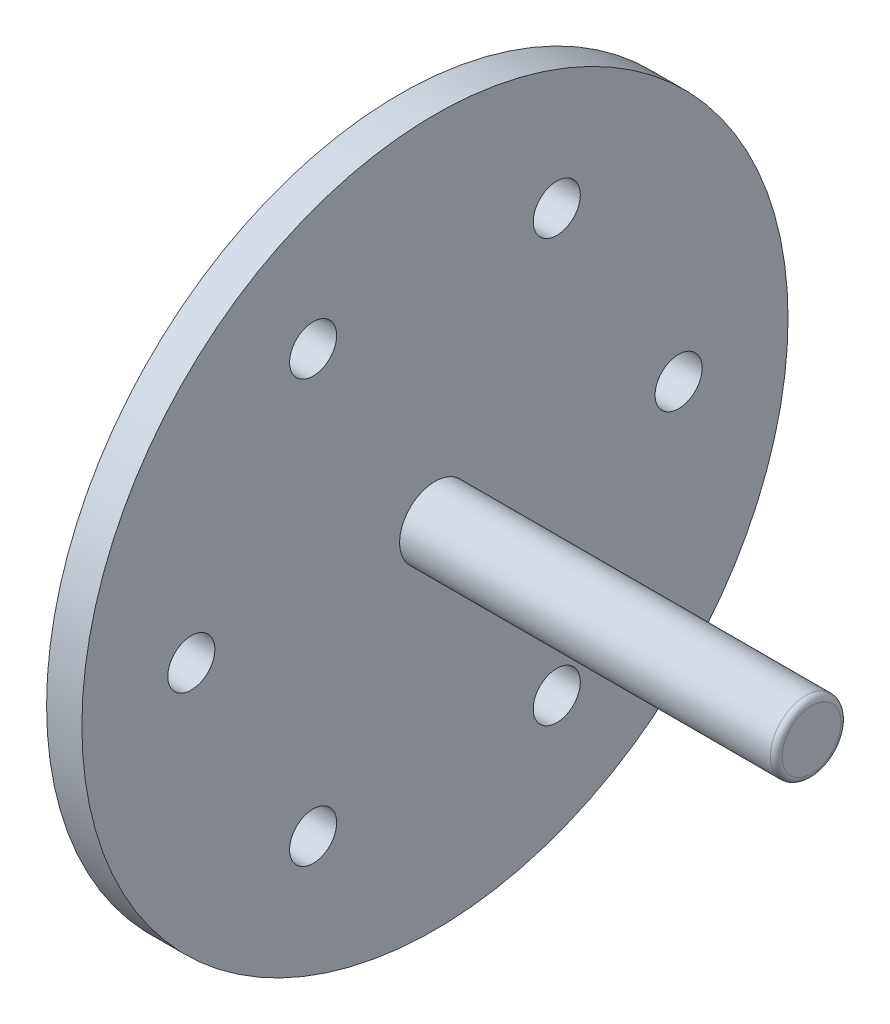
ISO-10303-21;
HEADER;
FILE_DESCRIPTION(('STEP AP214'),'2;1');
FILE_NAME('part.step','',(''),(''),'','','');
FILE_SCHEMA(('AUTOMOTIVE_DESIGN { 1 0 10303 214 1 1 1 1 }'));
ENDSEC;
DATA;
#1=APPLICATION_CONTEXT('core data for automotive mechanical design processes');
#2=APPLICATION_PROTOCOL_DEFINITION('international standard','automotive_design',2000,#1);
#3=PRODUCT_CONTEXT('',#1,'mechanical');
#4=PRODUCT('Part','Part','',(#3));
#5=PRODUCT_RELATED_PRODUCT_CATEGORY('part','',(#4));
#6=PRODUCT_DEFINITION_FORMATION('','',#4);
#7=PRODUCT_DEFINITION_CONTEXT('part definition',#1,'design');
#8=PRODUCT_DEFINITION('design','',#6,#7);
#9=PRODUCT_DEFINITION_SHAPE('','',#8);
#10=(LENGTH_UNIT() NAMED_UNIT(*) SI_UNIT(.MILLI.,.METRE.));
#11=(NAMED_UNIT(*) PLANE_ANGLE_UNIT() SI_UNIT($,.RADIAN.));
#12=(NAMED_UNIT(*) SI_UNIT($,.STERADIAN.) SOLID_ANGLE_UNIT());
#13=UNCERTAINTY_MEASURE_WITH_UNIT(LENGTH_MEASURE(1.E-05),#10,'distance_accuracy_value','');
#14=(GEOMETRIC_REPRESENTATION_CONTEXT(3) GLOBAL_UNCERTAINTY_ASSIGNED_CONTEXT((#13)) GLOBAL_UNIT_ASSIGNED_CONTEXT((#10,
#11,#12)) REPRESENTATION_CONTEXT('',''));
#15=CARTESIAN_POINT('',(0.,0.,0.));
#16=DIRECTION('',(0.,0.,1.));
#17=DIRECTION('',(1.,0.,0.));
#18=AXIS2_PLACEMENT_3D('',#15,#16,#17);
#19=CARTESIAN_POINT('',(3.,0.,0.));
#20=DIRECTION('',(-1.,0.,0.));
#21=DIRECTION('',(0.,0.,1.));
#22=AXIS2_PLACEMENT_3D('',#19,#20,#21);
#23=CYLINDRICAL_SURFACE('',#22,30.);
#24=CARTESIAN_POINT('',(3.,0.,0.));
#25=DIRECTION('',(1.,0.,0.));
#26=DIRECTION('',(0.,0.,-1.));
#27=AXIS2_PLACEMENT_3D('',#24,#25,#26);
#28=CIRCLE('',#27,30.);
#29=CARTESIAN_POINT('',(3.,0.,-30.));
#30=VERTEX_POINT('',#29);
#31=EDGE_CURVE('E46',#30,#30,#28,.T.);
#32=ORIENTED_EDGE('',*,*,#31,.F.);
#33=EDGE_LOOP('',(#32));
#34=FACE_BOUND('',#33,.T.);
#35=CARTESIAN_POINT('',(0.,0.,0.));
#36=DIRECTION('',(1.,0.,0.));
#37=DIRECTION('',(0.,0.,-1.));
#38=AXIS2_PLACEMENT_3D('',#35,#36,#37);
#39=CIRCLE('',#38,30.);
#40=CARTESIAN_POINT('',(0.,0.,-30.));
#41=VERTEX_POINT('',#40);
#42=EDGE_CURVE('E50',#41,#41,#39,.T.);
#43=ORIENTED_EDGE('',*,*,#42,.T.);
#44=EDGE_LOOP('',(#43));
#45=FACE_BOUND('',#44,.T.);
#46=ADVANCED_FACE('F35',(#34,#45),#23,.T.);
#47=CARTESIAN_POINT('',(3.,0.,0.));
#48=DIRECTION('',(1.,0.,0.));
#49=DIRECTION('',(0.,0.,-1.));
#50=AXIS2_PLACEMENT_3D('',#47,#48,#49);
#51=PLANE('',#50);
#52=CARTESIAN_POINT('',(3.,0.,0.));
#53=DIRECTION('',(1.,0.,0.));
#54=DIRECTION('',(0.,0.,-1.));
#55=AXIS2_PLACEMENT_3D('',#52,#53,#54);
#56=CIRCLE('',#55,3.);
#57=CARTESIAN_POINT('',(3.,0.,-3.));
#58=VERTEX_POINT('',#57);
#59=EDGE_CURVE('E87',#58,#58,#56,.T.);
#60=ORIENTED_EDGE('',*,*,#59,.F.);
#61=EDGE_LOOP('',(#60));
#62=FACE_BOUND('',#61,.T.);
#63=CARTESIAN_POINT('',(3.,0.,-20.7));
#64=DIRECTION('',(1.,0.,0.));
#65=DIRECTION('',(0.,0.,-1.));
#66=AXIS2_PLACEMENT_3D('',#63,#64,#65);
#67=CIRCLE('',#66,2.);
#68=CARTESIAN_POINT('',(3.,0.,-22.7));
#69=VERTEX_POINT('',#68);
#70=EDGE_CURVE('E54',#69,#69,#67,.T.);
#71=ORIENTED_EDGE('',*,*,#70,.F.);
#72=EDGE_LOOP('',(#71));
#73=FACE_BOUND('',#72,.T.);
#74=CARTESIAN_POINT('',(3.,17.9267258583378,-10.3500000000002));
#75=DIRECTION('',(1.,0.,0.));
#76=DIRECTION('',(0.,0.,-1.));
#77=AXIS2_PLACEMENT_3D('',#74,#75,#76);
#78=CIRCLE('',#77,2.);
#79=CARTESIAN_POINT('',(3.,17.9267258583378,-12.3500000000002));
#80=VERTEX_POINT('',#79);
#81=EDGE_CURVE('E63',#80,#80,#78,.T.);
#82=ORIENTED_EDGE('',*,*,#81,.F.);
#83=EDGE_LOOP('',(#82));
#84=FACE_BOUND('',#83,.T.);
#85=CARTESIAN_POINT('',(3.,17.926725858338,10.3499999999998));
#86=DIRECTION('',(1.,0.,0.));
#87=DIRECTION('',(0.,0.,-1.));
#88=AXIS2_PLACEMENT_3D('',#85,#86,#87);
#89=CIRCLE('',#88,2.);
#90=CARTESIAN_POINT('',(3.,17.926725858338,8.34999999999983));
#91=VERTEX_POINT('',#90);
#92=EDGE_CURVE('E56',#91,#91,#89,.T.);
#93=ORIENTED_EDGE('',*,*,#92,.F.);
#94=EDGE_LOOP('',(#93));
#95=FACE_BOUND('',#94,.T.);
#96=CARTESIAN_POINT('',(3.,1.44547327428106E-13,20.7));
#97=DIRECTION('',(1.,0.,0.));
#98=DIRECTION('',(0.,0.,-1.));
#99=AXIS2_PLACEMENT_3D('',#96,#97,#98);
#100=CIRCLE('',#99,2.);
#101=CARTESIAN_POINT('',(3.,1.44547327428106E-13,18.7));
#102=VERTEX_POINT('',#101);
#103=EDGE_CURVE('E64',#102,#102,#100,.T.);
#104=ORIENTED_EDGE('',*,*,#103,.F.);
#105=EDGE_LOOP('',(#104));
#106=FACE_BOUND('',#105,.T.);
#107=CARTESIAN_POINT('',(3.,-17.9267258583378,10.3500000000001));
#108=DIRECTION('',(1.,0.,0.));
#109=DIRECTION('',(0.,0.,-1.));
#110=AXIS2_PLACEMENT_3D('',#107,#108,#109);
#111=CIRCLE('',#110,2.);
#112=CARTESIAN_POINT('',(3.,-17.9267258583378,8.35000000000008));
#113=VERTEX_POINT('',#112);
#114=EDGE_CURVE('E70',#113,#113,#111,.T.);
#115=ORIENTED_EDGE('',*,*,#114,.F.);
#116=EDGE_LOOP('',(#115));
#117=FACE_BOUND('',#116,.T.);
#118=CARTESIAN_POINT('',(3.,-17.9267258583379,-10.35));
#119=DIRECTION('',(1.,0.,0.));
#120=DIRECTION('',(0.,0.,-1.));
#121=AXIS2_PLACEMENT_3D('',#118,#119,#120);
#122=CIRCLE('',#121,2.);
#123=CARTESIAN_POINT('',(3.,-17.9267258583379,-12.35));
#124=VERTEX_POINT('',#123);
#125=EDGE_CURVE('E76',#124,#124,#122,.T.);
#126=ORIENTED_EDGE('',*,*,#125,.F.);
#127=EDGE_LOOP('',(#126));
#128=FACE_BOUND('',#127,.T.);
#129=ORIENTED_EDGE('',*,*,#31,.T.);
#130=EDGE_LOOP('',(#129));
#131=FACE_BOUND('',#130,.T.);
#132=ADVANCED_FACE('F97',(#62,#73,#84,#95,#106,#117,#128,#131),#51,.T.);
#133=CARTESIAN_POINT('',(0.,0.,0.));
#134=DIRECTION('',(1.,0.,0.));
#135=DIRECTION('',(0.,0.,-1.));
#136=AXIS2_PLACEMENT_3D('',#133,#134,#135);
#137=PLANE('',#136);
#138=CARTESIAN_POINT('',(0.,0.,-20.7));
#139=DIRECTION('',(1.,0.,0.));
#140=DIRECTION('',(0.,0.,-1.));
#141=AXIS2_PLACEMENT_3D('',#138,#139,#140);
#142=CIRCLE('',#141,2.);
#143=CARTESIAN_POINT('',(0.,0.,-22.7));
#144=VERTEX_POINT('',#143);
#145=EDGE_CURVE('E79',#144,#144,#142,.T.);
#146=ORIENTED_EDGE('',*,*,#145,.T.);
#147=EDGE_LOOP('',(#146));
#148=FACE_BOUND('',#147,.T.);
#149=CARTESIAN_POINT('',(0.,17.9267258583378,-10.3500000000002));
#150=DIRECTION('',(1.,0.,0.));
#151=DIRECTION('',(0.,0.,-1.));
#152=AXIS2_PLACEMENT_3D('',#149,#150,#151);
#153=CIRCLE('',#152,2.);
#154=CARTESIAN_POINT('',(0.,17.9267258583378,-12.3500000000002));
#155=VERTEX_POINT('',#154);
#156=EDGE_CURVE('E84',#155,#155,#153,.T.);
#157=ORIENTED_EDGE('',*,*,#156,.T.);
#158=EDGE_LOOP('',(#157));
#159=FACE_BOUND('',#158,.T.);
#160=CARTESIAN_POINT('',(0.,17.926725858338,10.3499999999998));
#161=DIRECTION('',(1.,0.,0.));
#162=DIRECTION('',(0.,0.,-1.));
#163=AXIS2_PLACEMENT_3D('',#160,#161,#162);
#164=CIRCLE('',#163,2.);
#165=CARTESIAN_POINT('',(0.,17.926725858338,8.34999999999983));
#166=VERTEX_POINT('',#165);
#167=EDGE_CURVE('E60',#166,#166,#164,.T.);
#168=ORIENTED_EDGE('',*,*,#167,.T.);
#169=EDGE_LOOP('',(#168));
#170=FACE_BOUND('',#169,.T.);
#171=CARTESIAN_POINT('',(0.,1.44547327428106E-13,20.7));
#172=DIRECTION('',(1.,0.,0.));
#173=DIRECTION('',(0.,0.,-1.));
#174=AXIS2_PLACEMENT_3D('',#171,#172,#173);
#175=CIRCLE('',#174,2.);
#176=CARTESIAN_POINT('',(0.,1.44547327428106E-13,18.7));
#177=VERTEX_POINT('',#176);
#178=EDGE_CURVE('E59',#177,#177,#175,.T.);
#179=ORIENTED_EDGE('',*,*,#178,.T.);
#180=EDGE_LOOP('',(#179));
#181=FACE_BOUND('',#180,.T.);
#182=CARTESIAN_POINT('',(0.,-17.9267258583378,10.3500000000001));
#183=DIRECTION('',(1.,0.,0.));
#184=DIRECTION('',(0.,0.,-1.));
#185=AXIS2_PLACEMENT_3D('',#182,#183,#184);
#186=CIRCLE('',#185,2.);
#187=CARTESIAN_POINT('',(0.,-17.9267258583378,8.35000000000008));
#188=VERTEX_POINT('',#187);
#189=EDGE_CURVE('E67',#188,#188,#186,.T.);
#190=ORIENTED_EDGE('',*,*,#189,.T.);
#191=EDGE_LOOP('',(#190));
#192=FACE_BOUND('',#191,.T.);
#193=CARTESIAN_POINT('',(0.,-17.9267258583379,-10.35));
#194=DIRECTION('',(1.,0.,0.));
#195=DIRECTION('',(0.,0.,-1.));
#196=AXIS2_PLACEMENT_3D('',#193,#194,#195);
#197=CIRCLE('',#196,2.);
#198=CARTESIAN_POINT('',(0.,-17.9267258583379,-12.35));
#199=VERTEX_POINT('',#198);
#200=EDGE_CURVE('E73',#199,#199,#197,.T.);
#201=ORIENTED_EDGE('',*,*,#200,.T.);
#202=EDGE_LOOP('',(#201));
#203=FACE_BOUND('',#202,.T.);
#204=ORIENTED_EDGE('',*,*,#42,.F.);
#205=EDGE_LOOP('',(#204));
#206=FACE_BOUND('',#205,.T.);
#207=ADVANCED_FACE('F100',(#148,#159,#170,#181,#192,#203,#206),#137,.F.);
#208=CARTESIAN_POINT('',(8.65685424949238,-17.9267258583379,-10.35));
#209=DIRECTION('',(-1.,0.,0.));
#210=DIRECTION('',(0.,0.,1.));
#211=AXIS2_PLACEMENT_3D('',#208,#209,#210);
#212=CYLINDRICAL_SURFACE('',#211,2.);
#213=ORIENTED_EDGE('',*,*,#200,.F.);
#214=EDGE_LOOP('',(#213));
#215=FACE_BOUND('',#214,.T.);
#216=ORIENTED_EDGE('',*,*,#125,.T.);
#217=EDGE_LOOP('',(#216));
#218=FACE_BOUND('',#217,.T.);
#219=ADVANCED_FACE('F121',(#215,#218),#212,.F.);
#220=CARTESIAN_POINT('',(8.65685424949238,-17.9267258583378,10.3500000000001));
#221=DIRECTION('',(-1.,0.,0.));
#222=DIRECTION('',(0.,0.,1.));
#223=AXIS2_PLACEMENT_3D('',#220,#221,#222);
#224=CYLINDRICAL_SURFACE('',#223,2.);
#225=ORIENTED_EDGE('',*,*,#189,.F.);
#226=EDGE_LOOP('',(#225));
#227=FACE_BOUND('',#226,.T.);
#228=ORIENTED_EDGE('',*,*,#114,.T.);
#229=EDGE_LOOP('',(#228));
#230=FACE_BOUND('',#229,.T.);
#231=ADVANCED_FACE('F127',(#227,#230),#224,.F.);
#232=CARTESIAN_POINT('',(8.65685424949238,1.44547327428106E-13,20.7));
#233=DIRECTION('',(-1.,0.,0.));
#234=DIRECTION('',(0.,0.,1.));
#235=AXIS2_PLACEMENT_3D('',#232,#233,#234);
#236=CYLINDRICAL_SURFACE('',#235,2.);
#237=ORIENTED_EDGE('',*,*,#178,.F.);
#238=EDGE_LOOP('',(#237));
#239=FACE_BOUND('',#238,.T.);
#240=ORIENTED_EDGE('',*,*,#103,.T.);
#241=EDGE_LOOP('',(#240));
#242=FACE_BOUND('',#241,.T.);
#243=ADVANCED_FACE('F136',(#239,#242),#236,.F.);
#244=CARTESIAN_POINT('',(8.65685424949238,17.926725858338,10.3499999999998));
#245=DIRECTION('',(-1.,0.,0.));
#246=DIRECTION('',(0.,0.,1.));
#247=AXIS2_PLACEMENT_3D('',#244,#245,#246);
#248=CYLINDRICAL_SURFACE('',#247,2.);
#249=ORIENTED_EDGE('',*,*,#167,.F.);
#250=EDGE_LOOP('',(#249));
#251=FACE_BOUND('',#250,.T.);
#252=ORIENTED_EDGE('',*,*,#92,.T.);
#253=EDGE_LOOP('',(#252));
#254=FACE_BOUND('',#253,.T.);
#255=ADVANCED_FACE('F132',(#251,#254),#248,.F.);
#256=CARTESIAN_POINT('',(8.65685424949238,17.9267258583378,-10.3500000000002));
#257=DIRECTION('',(-1.,0.,0.));
#258=DIRECTION('',(0.,0.,1.));
#259=AXIS2_PLACEMENT_3D('',#256,#257,#258);
#260=CYLINDRICAL_SURFACE('',#259,2.);
#261=ORIENTED_EDGE('',*,*,#156,.F.);
#262=EDGE_LOOP('',(#261));
#263=FACE_BOUND('',#262,.T.);
#264=ORIENTED_EDGE('',*,*,#81,.T.);
#265=EDGE_LOOP('',(#264));
#266=FACE_BOUND('',#265,.T.);
#267=ADVANCED_FACE('F135',(#263,#266),#260,.F.);
#268=CARTESIAN_POINT('',(8.65685424949238,0.,-20.7));
#269=DIRECTION('',(-1.,0.,0.));
#270=DIRECTION('',(0.,0.,1.));
#271=AXIS2_PLACEMENT_3D('',#268,#269,#270);
#272=CYLINDRICAL_SURFACE('',#271,2.);
#273=ORIENTED_EDGE('',*,*,#145,.F.);
#274=EDGE_LOOP('',(#273));
#275=FACE_BOUND('',#274,.T.);
#276=ORIENTED_EDGE('',*,*,#70,.T.);
#277=EDGE_LOOP('',(#276));
#278=FACE_BOUND('',#277,.T.);
#279=ADVANCED_FACE('F146',(#275,#278),#272,.F.);
#280=CARTESIAN_POINT('',(35.,0.,0.));
#281=DIRECTION('',(-1.,0.,0.));
#282=DIRECTION('',(0.,0.,1.));
#283=AXIS2_PLACEMENT_3D('',#280,#281,#282);
#284=CYLINDRICAL_SURFACE('',#283,3.);
#285=CARTESIAN_POINT('',(34.5,0.,0.));
#286=DIRECTION('',(1.,0.,0.));
#287=DIRECTION('',(0.,0.,-1.));
#288=AXIS2_PLACEMENT_3D('',#285,#286,#287);
#289=CIRCLE('',#288,3.);
#290=CARTESIAN_POINT('',(34.5,0.,-3.));
#291=VERTEX_POINT('',#290);
#292=EDGE_CURVE('E10',#291,#291,#289,.F.);
#293=ORIENTED_EDGE('',*,*,#292,.T.);
#294=EDGE_LOOP('',(#293));
#295=FACE_BOUND('',#294,.T.);
#296=ORIENTED_EDGE('',*,*,#59,.T.);
#297=EDGE_LOOP('',(#296));
#298=FACE_BOUND('',#297,.T.);
#299=ADVANCED_FACE('F95',(#295,#298),#284,.T.);
#300=CARTESIAN_POINT('',(35.,0.,0.));
#301=DIRECTION('',(1.,0.,0.));
#302=DIRECTION('',(0.,0.,-1.));
#303=AXIS2_PLACEMENT_3D('',#300,#301,#302);
#304=PLANE('',#303);
#305=CARTESIAN_POINT('',(35.,0.,0.));
#306=DIRECTION('',(1.,0.,0.));
#307=DIRECTION('',(0.,0.,-1.));
#308=AXIS2_PLACEMENT_3D('',#305,#306,#307);
#309=CIRCLE('',#308,2.5);
#310=CARTESIAN_POINT('',(35.,0.,-2.5));
#311=VERTEX_POINT('',#310);
#312=EDGE_CURVE('E42',#311,#311,#309,.T.);
#313=ORIENTED_EDGE('',*,*,#312,.T.);
#314=EDGE_LOOP('',(#313));
#315=FACE_BOUND('',#314,.T.);
#316=ADVANCED_FACE('F153',(#315),#304,.T.);
#317=CARTESIAN_POINT('',(34.5,0.,0.));
#318=DIRECTION('',(1.,0.,0.));
#319=DIRECTION('',(0.,0.,-1.));
#320=AXIS2_PLACEMENT_3D('',#317,#318,#319);
#321=TOROIDAL_SURFACE('',#320,2.5,0.5);
#322=ORIENTED_EDGE('',*,*,#292,.F.);
#323=EDGE_LOOP('',(#322));
#324=FACE_BOUND('',#323,.T.);
#325=ORIENTED_EDGE('',*,*,#312,.F.);
#326=EDGE_LOOP('',(#325));
#327=FACE_BOUND('',#326,.T.);
#328=ADVANCED_FACE('F37',(#324,#327),#321,.T.);
#329=CLOSED_SHELL('',(#46,#132,#207,#219,#231,#243,#255,#267,#279,#299,#316,#328));
#330=MANIFOLD_SOLID_BREP('B2',#329);
#331=ADVANCED_BREP_SHAPE_REPRESENTATION('',(#18,#330),#14);
#332=SHAPE_DEFINITION_REPRESENTATION(#9,#331);
ENDSEC;
END-ISO-10303-21;
